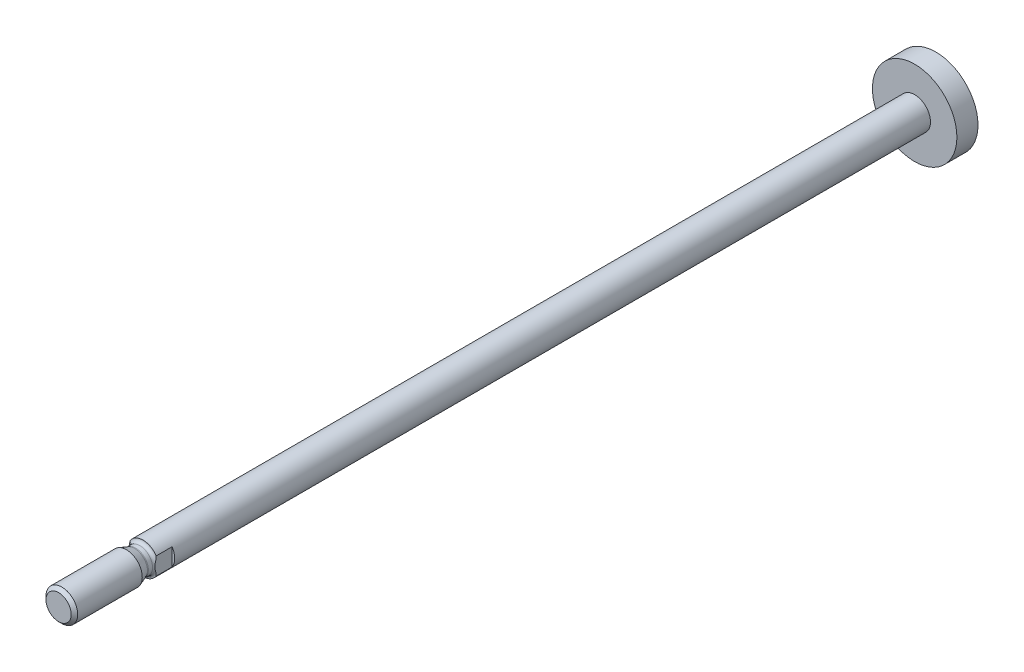
ISO-10303-21;
HEADER;
FILE_DESCRIPTION(('STEP AP214'),'2;1');
FILE_NAME('part.step','',(''),(''),'','','');
FILE_SCHEMA(('AUTOMOTIVE_DESIGN { 1 0 10303 214 1 1 1 1 }'));
ENDSEC;
DATA;
#1=APPLICATION_CONTEXT('core data for automotive mechanical design processes');
#2=APPLICATION_PROTOCOL_DEFINITION('international standard','automotive_design',2000,#1);
#3=PRODUCT_CONTEXT('',#1,'mechanical');
#4=PRODUCT('Part','Part','',(#3));
#5=PRODUCT_RELATED_PRODUCT_CATEGORY('part','',(#4));
#6=PRODUCT_DEFINITION_FORMATION('','',#4);
#7=PRODUCT_DEFINITION_CONTEXT('part definition',#1,'design');
#8=PRODUCT_DEFINITION('design','',#6,#7);
#9=PRODUCT_DEFINITION_SHAPE('','',#8);
#10=(LENGTH_UNIT() NAMED_UNIT(*) SI_UNIT(.MILLI.,.METRE.));
#11=(NAMED_UNIT(*) PLANE_ANGLE_UNIT() SI_UNIT($,.RADIAN.));
#12=(NAMED_UNIT(*) SI_UNIT($,.STERADIAN.) SOLID_ANGLE_UNIT());
#13=UNCERTAINTY_MEASURE_WITH_UNIT(LENGTH_MEASURE(1.E-05),#10,'distance_accuracy_value','');
#14=(GEOMETRIC_REPRESENTATION_CONTEXT(3) GLOBAL_UNCERTAINTY_ASSIGNED_CONTEXT((#13)) GLOBAL_UNIT_ASSIGNED_CONTEXT((#10,
#11,#12)) REPRESENTATION_CONTEXT('',''));
#15=CARTESIAN_POINT('',(0.,0.,0.));
#16=DIRECTION('',(0.,0.,1.));
#17=DIRECTION('',(1.,0.,0.));
#18=AXIS2_PLACEMENT_3D('',#15,#16,#17);
#19=CARTESIAN_POINT('',(0.,0.,-145.2));
#20=DIRECTION('',(0.,0.,1.));
#21=DIRECTION('',(1.,0.,0.));
#22=AXIS2_PLACEMENT_3D('',#19,#20,#21);
#23=CYLINDRICAL_SURFACE('',#22,3.);
#24=CARTESIAN_POINT('',(0.,0.,-141.2));
#25=DIRECTION('',(0.,0.,1.));
#26=DIRECTION('',(1.,0.,0.));
#27=AXIS2_PLACEMENT_3D('',#24,#25,#26);
#28=CIRCLE('',#27,3.);
#29=CARTESIAN_POINT('',(3.,0.,-141.2));
#30=VERTEX_POINT('',#29);
#31=EDGE_CURVE('E123',#30,#30,#28,.T.);
#32=ORIENTED_EDGE('',*,*,#31,.T.);
#33=EDGE_LOOP('',(#32));
#34=FACE_BOUND('',#33,.T.);
#35=DIRECTION('',(0.,0.,1.));
#36=VECTOR('',#35,1.);
#37=CARTESIAN_POINT('',(-2.5,-1.6583123951777,-145.2));
#38=LINE('',#37,#36);
#39=CARTESIAN_POINT('',(-2.5,-1.6583123951777,2.));
#40=VERTEX_POINT('',#39);
#41=CARTESIAN_POINT('',(-2.5,-1.6583123951777,5.));
#42=VERTEX_POINT('',#41);
#43=EDGE_CURVE('E53',#40,#42,#38,.T.);
#44=ORIENTED_EDGE('',*,*,#43,.F.);
#45=CARTESIAN_POINT('',(0.,0.,2.));
#46=DIRECTION('',(0.,0.,1.));
#47=DIRECTION('',(1.,0.,0.));
#48=AXIS2_PLACEMENT_3D('',#45,#46,#47);
#49=CIRCLE('',#48,3.);
#50=CARTESIAN_POINT('',(-2.5,1.6583123951777,2.));
#51=VERTEX_POINT('',#50);
#52=EDGE_CURVE('E11',#51,#40,#49,.T.);
#53=ORIENTED_EDGE('',*,*,#52,.F.);
#54=DIRECTION('',(0.,0.,1.));
#55=VECTOR('',#54,1.);
#56=CARTESIAN_POINT('',(-2.5,1.6583123951777,-145.2));
#57=LINE('',#56,#55);
#58=CARTESIAN_POINT('',(-2.5,1.65831239517778,4.99999999999909));
#59=VERTEX_POINT('',#58);
#60=EDGE_CURVE('E93',#59,#51,#57,.F.);
#61=ORIENTED_EDGE('',*,*,#60,.F.);
#62=CARTESIAN_POINT('',(0.,0.,5.));
#63=DIRECTION('',(0.,0.,1.));
#64=DIRECTION('',(1.,0.,0.));
#65=AXIS2_PLACEMENT_3D('',#62,#63,#64);
#66=CIRCLE('',#65,3.);
#67=CARTESIAN_POINT('',(2.5,1.6583123951777,5.));
#68=VERTEX_POINT('',#67);
#69=EDGE_CURVE('E92',#68,#59,#66,.T.);
#70=ORIENTED_EDGE('',*,*,#69,.F.);
#71=DIRECTION('',(0.,0.,1.));
#72=VECTOR('',#71,1.);
#73=CARTESIAN_POINT('',(2.5,1.6583123951777,-145.2));
#74=LINE('',#73,#72);
#75=CARTESIAN_POINT('',(2.5,1.6583123951777,2.));
#76=VERTEX_POINT('',#75);
#77=EDGE_CURVE('E61',#76,#68,#74,.T.);
#78=ORIENTED_EDGE('',*,*,#77,.F.);
#79=CARTESIAN_POINT('',(2.5,-1.6583123951777,2.));
#80=VERTEX_POINT('',#79);
#81=EDGE_CURVE('E42',#80,#76,#49,.T.);
#82=ORIENTED_EDGE('',*,*,#81,.F.);
#83=DIRECTION('',(0.,0.,1.));
#84=VECTOR('',#83,1.);
#85=CARTESIAN_POINT('',(2.5,-1.6583123951777,-145.2));
#86=LINE('',#85,#84);
#87=CARTESIAN_POINT('',(2.5,-1.65831239517778,4.99999999999909));
#88=VERTEX_POINT('',#87);
#89=EDGE_CURVE('E86',#88,#80,#86,.F.);
#90=ORIENTED_EDGE('',*,*,#89,.F.);
#91=EDGE_CURVE('E126',#42,#88,#66,.T.);
#92=ORIENTED_EDGE('',*,*,#91,.F.);
#93=EDGE_LOOP('',(#44,#53,#61,#70,#78,#82,#90,#92));
#94=FACE_BOUND('',#93,.T.);
#95=ADVANCED_FACE('F39',(#34,#94),#23,.T.);
#96=CARTESIAN_POINT('',(0.,0.,5.6000000000001));
#97=DIRECTION('',(0.,0.,1.));
#98=DIRECTION('',(1.,0.,0.));
#99=AXIS2_PLACEMENT_3D('',#96,#97,#98);
#100=TOROIDAL_SURFACE('',#99,3.0000000000001,0.600000000000099);
#101=CARTESIAN_POINT('',(0.,0.,5.6));
#102=DIRECTION('',(0.,0.,1.));
#103=DIRECTION('',(1.,0.,0.));
#104=AXIS2_PLACEMENT_3D('',#101,#102,#103);
#105=CIRCLE('',#104,2.4);
#106=CARTESIAN_POINT('',(2.4,0.,5.6));
#107=VERTEX_POINT('',#106);
#108=EDGE_CURVE('E114',#107,#107,#105,.T.);
#109=ORIENTED_EDGE('',*,*,#108,.F.);
#110=EDGE_LOOP('',(#109));
#111=FACE_BOUND('',#110,.T.);
#112=CARTESIAN_POINT('',(-2.5,0.,5.26833752096453));
#113=CARTESIAN_POINT('',(-2.5,0.0507234426297441,5.26834839993848));
#114=CARTESIAN_POINT('',(-2.5,0.101441776799662,5.26596843791489));
#115=CARTESIAN_POINT('',(-2.5,0.202536067556288,5.2569952015163));
#116=CARTESIAN_POINT('',(-2.5,0.252911588949165,5.2503973212644));
#117=CARTESIAN_POINT('',(-2.5,0.35392632203634,5.23403658213965));
#118=CARTESIAN_POINT('',(-2.5,0.404557369480025,5.224225913585));
#119=CARTESIAN_POINT('',(-2.5,0.505400398866161,5.20278595137819));
#120=CARTESIAN_POINT('',(-2.5,0.555612509775304,5.1911572409283));
#121=CARTESIAN_POINT('',(-2.5,0.655655613826413,5.16721678219831));
#122=CARTESIAN_POINT('',(-2.5,0.705487327239528,5.15490798008948));
#123=CARTESIAN_POINT('',(-2.5,0.805181864056362,5.13041893752706));
#124=CARTESIAN_POINT('',(-2.5,0.855044688832192,5.11823870324147));
#125=CARTESIAN_POINT('',(-2.5,1.00507376125951,5.08293674920261));
#126=CARTESIAN_POINT('',(-2.5,1.1055660279648,5.06108488117838));
#127=CARTESIAN_POINT('',(-2.5,1.30645493621981,5.02592717471424));
#128=CARTESIAN_POINT('',(-2.5,1.40682678389803,5.01248870030289));
#129=CARTESIAN_POINT('',(-2.5,1.60840199518987,4.99838763017595));
#130=CARTESIAN_POINT('',(-2.5,1.70960094347028,4.99767823287719));
#131=CARTESIAN_POINT('',(-2.5,1.86622781794818,5.01106448653587));
#132=CARTESIAN_POINT('',(-2.5,1.92218137883188,5.01877622049858));
#133=CARTESIAN_POINT('',(-2.5,2.03285053262341,5.0413651074687));
#134=CARTESIAN_POINT('',(-2.5,2.08756307823151,5.05625824117348));
#135=CARTESIAN_POINT('',(-2.5,2.18328084843635,5.09083457513036));
#136=CARTESIAN_POINT('',(-2.5,2.22483950461237,5.10896465354793));
#137=CARTESIAN_POINT('',(-2.5,2.30459524648064,5.1515245306446));
#138=CARTESIAN_POINT('',(-2.5,2.34279989724468,5.17593963670877));
#139=CARTESIAN_POINT('',(-2.5,2.40362753966407,5.22361594487622));
#140=CARTESIAN_POINT('',(-2.5,2.42757076392253,5.24518752529637));
#141=CARTESIAN_POINT('',(-2.5,2.47175757689057,5.29185573262645));
#142=CARTESIAN_POINT('',(-2.5,2.49200531158724,5.31694835263777));
#143=CARTESIAN_POINT('',(-2.5,2.52468492158815,5.36594738678137));
#144=CARTESIAN_POINT('',(-2.5,2.53785643218482,5.38935828111803));
#145=CARTESIAN_POINT('',(-2.5,2.56013164913301,5.43805384411947));
#146=CARTESIAN_POINT('',(-2.5,2.56923737677398,5.46333757440499));
#147=CARTESIAN_POINT('',(-2.5,2.58283057049981,5.51527496834575));
#148=CARTESIAN_POINT('',(-2.5,2.58729356105886,5.54193512227162));
#149=CARTESIAN_POINT('',(-2.5,2.59118020467599,5.59561989324821));
#150=CARTESIAN_POINT('',(-2.5,2.5906054179438,5.62264439487102));
#151=CARTESIAN_POINT('',(-2.5,2.5847447911938,5.67371298536964));
#152=CARTESIAN_POINT('',(-2.5,2.57988467167735,5.69780754958458));
#153=CARTESIAN_POINT('',(-2.5,2.56633022368149,5.74488485425705));
#154=CARTESIAN_POINT('',(-2.5,2.55763543991684,5.76786746233366));
#155=CARTESIAN_POINT('',(-2.5,2.53647695281551,5.81308697753744));
#156=CARTESIAN_POINT('',(-2.5,2.52388217742275,5.83526203314746));
#157=CARTESIAN_POINT('',(-2.5,2.49565831542702,5.87756858678122));
#158=CARTESIAN_POINT('',(-2.5,2.4800283022487,5.897699457906));
#159=CARTESIAN_POINT('',(-2.5,2.4381803160609,5.94494905141413));
#160=CARTESIAN_POINT('',(-2.5,2.41048793322772,5.97076525046522));
#161=CARTESIAN_POINT('',(-2.5,2.35128940318857,6.01762864695372));
#162=CARTESIAN_POINT('',(-2.5,2.31977194494069,6.03866114436212));
#163=CARTESIAN_POINT('',(-2.5,2.23952256294481,6.08463351159361));
#164=CARTESIAN_POINT('',(-2.5,2.18939204577726,6.10711912432076));
#165=CARTESIAN_POINT('',(-2.5,2.086424206848,6.14398267826286));
#166=CARTESIAN_POINT('',(-2.5,2.03358928965091,6.15836768991921));
#167=CARTESIAN_POINT('',(-2.5,1.93599580204544,6.17849484994285));
#168=CARTESIAN_POINT('',(-2.5,1.89144834077192,6.18531116329585));
#169=CARTESIAN_POINT('',(-2.5,1.80189908033616,6.19505697557448));
#170=CARTESIAN_POINT('',(-2.5,1.75689686177072,6.19798247787778));
#171=CARTESIAN_POINT('',(-2.5,1.66646832286127,6.20053377831371));
#172=CARTESIAN_POINT('',(-2.5,1.6210413945456,6.20013412759755));
#173=CARTESIAN_POINT('',(-2.5,1.53034280767568,6.19650595241103));
#174=CARTESIAN_POINT('',(-2.5,1.48507106445849,6.1932793543307));
#175=CARTESIAN_POINT('',(-2.5,1.33918047559004,6.17906735223514));
#176=CARTESIAN_POINT('',(-2.5,1.23902345631669,6.16342028964884));
#177=CARTESIAN_POINT('',(-2.5,1.03994836030368,6.12508984420092));
#178=CARTESIAN_POINT('',(-2.5,0.941034235224376,6.10238806221333));
#179=CARTESIAN_POINT('',(-2.5,0.793509038998567,6.06677672186832));
#180=CARTESIAN_POINT('',(-2.5,0.7446863854637,6.054702575567));
#181=CARTESIAN_POINT('',(-2.5,0.646996290398524,6.030738686552));
#182=CARTESIAN_POINT('',(-2.5,0.598128851070118,6.0188489352388));
#183=CARTESIAN_POINT('',(-2.5,0.500334281886721,5.99617397742217));
#184=CARTESIAN_POINT('',(-2.5,0.451408146263369,5.98538460255591));
#185=CARTESIAN_POINT('',(-2.5,0.353119090508098,5.96594052833405));
#186=CARTESIAN_POINT('',(-2.5,0.303756196305667,5.95728570312374));
#187=CARTESIAN_POINT('',(-2.5,0.204122497966492,5.94328110899502));
#188=CARTESIAN_POINT('',(-2.5,0.153847567097064,5.93795905985694));
#189=CARTESIAN_POINT('',(-2.5,0.0530351286873156,5.93177082830429));
#190=CARTESIAN_POINT('',(-2.5,0.0024977994589948,5.930901937583));
#191=CARTESIAN_POINT('',(-2.5,-0.0985305210715612,5.93381110626722));
#192=CARTESIAN_POINT('',(-2.5,-0.14902123482016,5.93759813511376));
#193=CARTESIAN_POINT('',(-2.5,-0.249573888409545,5.94904126176878));
#194=CARTESIAN_POINT('',(-2.5,-0.299635458091892,5.95670041313862));
#195=CARTESIAN_POINT('',(-2.5,-0.399725252919972,5.97472154484855));
#196=CARTESIAN_POINT('',(-2.5,-0.449748880216866,5.98510788708088));
#197=CARTESIAN_POINT('',(-2.5,-0.549453617514231,6.00732659888942));
#198=CARTESIAN_POINT('',(-2.5,-0.599134785603654,6.01915871651809));
#199=CARTESIAN_POINT('',(-2.5,-0.698392421521691,6.04328051823731));
#200=CARTESIAN_POINT('',(-2.5,-0.747968869022546,6.05557028383309));
#201=CARTESIAN_POINT('',(-2.5,-0.84720464589227,6.07981009984425));
#202=CARTESIAN_POINT('',(-2.5,-0.896863971124109,6.0917601667094));
#203=CARTESIAN_POINT('',(-2.5,-0.975241469303783,6.10978478042876));
#204=CARTESIAN_POINT('',(-2.5,-1.00388150216564,6.11619624816889));
#205=CARTESIAN_POINT('',(-2.5,-1.06125902675178,6.12857195456169));
#206=CARTESIAN_POINT('',(-2.5,-1.08999652018277,6.13453618533974));
#207=CARTESIAN_POINT('',(-2.5,-1.14748265723325,6.1458846074232));
#208=CARTESIAN_POINT('',(-2.5,-1.17623091126653,6.15127075206469));
#209=CARTESIAN_POINT('',(-2.5,-1.23384312688132,6.16137594760793));
#210=CARTESIAN_POINT('',(-2.5,-1.26270708577413,6.16609501391968));
#211=CARTESIAN_POINT('',(-2.5,-1.34949136584038,6.17908804539659));
#212=CARTESIAN_POINT('',(-2.5,-1.40759592627029,6.18619616796949));
#213=CARTESIAN_POINT('',(-2.5,-1.52420669712544,6.19636423685649));
#214=CARTESIAN_POINT('',(-2.5,-1.58271310503325,6.1994220245478));
#215=CARTESIAN_POINT('',(-2.5,-1.70911532678372,6.20051114496721));
#216=CARTESIAN_POINT('',(-2.5,-1.77702602049488,6.19766666103081));
#217=CARTESIAN_POINT('',(-2.5,-1.912149147007,6.18315262249392));
#218=CARTESIAN_POINT('',(-2.5,-1.97936016975703,6.17146782027944));
#219=CARTESIAN_POINT('',(-2.5,-2.09293467910467,6.14162835403314));
#220=CARTESIAN_POINT('',(-2.5,-2.1399801193776,6.12611102431254));
#221=CARTESIAN_POINT('',(-2.5,-2.23116163556241,6.08815370009842));
#222=CARTESIAN_POINT('',(-2.5,-2.27530548479003,6.06573319994486));
#223=CARTESIAN_POINT('',(-2.5,-2.34660579555824,6.0206656653127));
#224=CARTESIAN_POINT('',(-2.5,-2.37498330055351,5.99995880382842));
#225=CARTESIAN_POINT('',(-2.5,-2.42818185419372,5.95435228802646));
#226=CARTESIAN_POINT('',(-2.5,-2.45300628498281,5.92945667074117));
#227=CARTESIAN_POINT('',(-2.5,-2.49337206402375,5.88080957286876));
#228=CARTESIAN_POINT('',(-2.5,-2.50977972671913,5.85778028891266));
#229=CARTESIAN_POINT('',(-2.5,-2.5385948801776,5.80932543735906));
#230=CARTESIAN_POINT('',(-2.5,-2.55100468980703,5.7839012699618));
#231=CARTESIAN_POINT('',(-2.5,-2.57111606880391,5.7310152189761));
#232=CARTESIAN_POINT('',(-2.5,-2.57878240755407,5.70353974708557));
#233=CARTESIAN_POINT('',(-2.5,-2.58865812747843,5.64762323062993));
#234=CARTESIAN_POINT('',(-2.5,-2.59087093912576,5.61918280447873));
#235=CARTESIAN_POINT('',(-2.5,-2.58974032110845,5.56589468768046));
#236=CARTESIAN_POINT('',(-2.5,-2.58704036062141,5.54103102121321));
#237=CARTESIAN_POINT('',(-2.5,-2.57748265423562,5.49212434637714));
#238=CARTESIAN_POINT('',(-2.5,-2.57062518368025,5.46808128377277));
#239=CARTESIAN_POINT('',(-2.5,-2.55318309970271,5.42147694109437));
#240=CARTESIAN_POINT('',(-2.5,-2.54260847384664,5.39891188066154));
#241=CARTESIAN_POINT('',(-2.5,-2.51826231502416,5.35558968714916));
#242=CARTESIAN_POINT('',(-2.5,-2.50448933519591,5.33483337816906));
#243=CARTESIAN_POINT('',(-2.5,-2.46797257111134,5.28708275256527));
#244=CARTESIAN_POINT('',(-2.5,-2.44388663659998,5.26111270404154));
#245=CARTESIAN_POINT('',(-2.5,-2.39183121173732,5.21341702762138));
#246=CARTESIAN_POINT('',(-2.5,-2.36385414462067,5.19169988455002));
#247=CARTESIAN_POINT('',(-2.5,-2.29309604385226,5.14424955817408));
#248=CARTESIAN_POINT('',(-2.5,-2.24896151787955,5.12054273771195));
#249=CARTESIAN_POINT('',(-2.5,-2.15755724893995,5.08032986787273));
#250=CARTESIAN_POINT('',(-2.5,-2.1102815253453,5.0638380357592));
#251=CARTESIAN_POINT('',(-2.5,-1.98539576167196,5.02901994971649));
#252=CARTESIAN_POINT('',(-2.5,-1.90647682078743,5.01544295171964));
#253=CARTESIAN_POINT('',(-2.5,-1.74768813149434,5.00017484346382));
#254=CARTESIAN_POINT('',(-2.5,-1.66781762927049,4.99849388464395));
#255=CARTESIAN_POINT('',(-2.5,-1.45429321635247,5.00579419289827));
#256=CARTESIAN_POINT('',(-2.5,-1.32097329964418,5.02279704607492));
#257=CARTESIAN_POINT('',(-2.5,-1.12273292987174,5.05843900515103));
#258=CARTESIAN_POINT('',(-2.5,-1.05669317759064,5.07208123732001));
#259=CARTESIAN_POINT('',(-2.5,-0.925080173294097,5.10144856377507));
#260=CARTESIAN_POINT('',(-2.5,-0.85950678696237,5.11717303045709));
#261=CARTESIAN_POINT('',(-2.5,-0.728157455724953,5.14928145287764));
#262=CARTESIAN_POINT('',(-2.5,-0.662382356378558,5.16566853749943));
#263=CARTESIAN_POINT('',(-2.5,-0.530451230737349,5.19710748690057));
#264=CARTESIAN_POINT('',(-2.5,-0.46429498692756,5.21215848739435));
#265=CARTESIAN_POINT('',(-2.5,-0.332137198799993,5.23811298682939));
#266=CARTESIAN_POINT('',(-2.5,-0.266147995614798,5.24907485812429));
#267=CARTESIAN_POINT('',(-2.5,-0.13343508853748,5.26417313941374));
#268=CARTESIAN_POINT('',(-2.5,-0.0667131258677896,5.26832321258322));
#269=CARTESIAN_POINT('',(-2.5,0.,5.26833752096453));
#270=B_SPLINE_CURVE_WITH_KNOTS('',3,(#112,#113,#114,#115,#116,#117,#118,#119,#120,#121,#122,
#123,#124,#125,#126,#127,#128,#129,#130,#131,#132,#133,#134,#135,#136,#137,#138,#139,#140,#141,
#142,#143,#144,#145,#146,#147,#148,#149,#150,#151,#152,#153,#154,#155,#156,#157,#158,#159,#160,
#161,#162,#163,#164,#165,#166,#167,#168,#169,#170,#171,#172,#173,#174,#175,#176,#177,#178,#179,
#180,#181,#182,#183,#184,#185,#186,#187,#188,#189,#190,#191,#192,#193,#194,#195,#196,#197,#198,
#199,#200,#201,#202,#203,#204,#205,#206,#207,#208,#209,#210,#211,#212,#213,#214,#215,#216,#217,
#218,#219,#220,#221,#222,#223,#224,#225,#226,#227,#228,#229,#230,#231,#232,#233,#234,#235,#236,
#237,#238,#239,#240,#241,#242,#243,#244,#245,#246,#247,#248,#249,#250,#251,#252,#253,#254,#255,
#256,#257,#258,#259,#260,#261,#262,#263,#264,#265,#266,#267,#268,#269),.UNSPECIFIED.,.T.,.F.,(4,
2,2,2,2,2,2,2,2,2,2,2,2,2,2,2,2,2,2,2,2,2,2,2,2,2,2,2,2,2,2,2,2,2,2,2,2,2,2,2,2,2,2,2,2,2,2,2,2,
2,2,2,2,2,2,2,2,2,2,2,2,2,2,2,2,2,2,2,2,2,2,2,2,2,2,2,2,2,4),(0.,0.152115749462961,
0.304397890479205,0.459057777660119,0.613668153537359,0.76765452052503,0.921648241698668,
1.22999186740174,1.53334327295527,1.83557910296654,2.00468122496769,2.17416139710525,
2.30975526259906,2.44503498191611,2.54138706790922,2.63763038250484,2.71788414225495,
2.79809795959123,2.87873253660465,2.95934214181033,3.03274594433316,3.10615846435156,
3.18237030946167,3.25860545664829,3.37154774885102,3.48483255287211,3.64874326809032,
3.81251069461259,3.94751849926572,4.08266487644991,4.21884653384819,4.35493546397263,
4.65852821936571,4.96291950372185,5.11380283698696,5.2646791123006,5.41496078164642,
5.56523358814694,5.71674021710462,5.86815469233289,6.01986131905259,6.17168776888823,
6.3249195654772,6.47812469716163,6.63135724578266,6.7845823615018,6.87262624262423,
6.9606716735928,7.04840955727845,7.13614541382411,7.31164210225534,7.487232283928,
7.69072100095721,7.89456149389004,8.04275027379228,8.1905243529531,8.29556794817655,
8.40051087855684,8.48500651711341,8.56945305722983,8.65451949621374,8.73953241154295,
8.81419843639983,8.88885951681877,8.96332150589878,9.03781724571823,9.14348655987521,
9.24936459025057,9.39882327642183,9.54857516145059,9.78744806917548,10.0265247936209,
10.4280628477144,10.630387719692,10.8326517473681,11.0360188284461,11.239516519211,
11.439986712254,11.6400543065313),.UNSPECIFIED.);
#271=EDGE_CURVE('E84',#42,#59,#270,.T.);
#272=ORIENTED_EDGE('',*,*,#271,.F.);
#273=ORIENTED_EDGE('',*,*,#91,.T.);
#274=CARTESIAN_POINT('',(2.5,0.,5.26833752096453));
#275=CARTESIAN_POINT('',(2.5,-0.0507234426297441,5.26834839993848));
#276=CARTESIAN_POINT('',(2.5,-0.101441776799662,5.26596843791489));
#277=CARTESIAN_POINT('',(2.5,-0.202536067556288,5.2569952015163));
#278=CARTESIAN_POINT('',(2.5,-0.252911588949165,5.2503973212644));
#279=CARTESIAN_POINT('',(2.5,-0.35392632203634,5.23403658213965));
#280=CARTESIAN_POINT('',(2.5,-0.404557369480025,5.224225913585));
#281=CARTESIAN_POINT('',(2.5,-0.505400398866161,5.20278595137819));
#282=CARTESIAN_POINT('',(2.5,-0.555612509775304,5.1911572409283));
#283=CARTESIAN_POINT('',(2.5,-0.655655613826413,5.16721678219831));
#284=CARTESIAN_POINT('',(2.5,-0.705487327239528,5.15490798008948));
#285=CARTESIAN_POINT('',(2.5,-0.805181864056362,5.13041893752706));
#286=CARTESIAN_POINT('',(2.5,-0.855044688832192,5.11823870324147));
#287=CARTESIAN_POINT('',(2.5,-1.00507376125951,5.08293674920261));
#288=CARTESIAN_POINT('',(2.5,-1.1055660279648,5.06108488117838));
#289=CARTESIAN_POINT('',(2.5,-1.30645493621981,5.02592717471424));
#290=CARTESIAN_POINT('',(2.5,-1.40682678389803,5.01248870030289));
#291=CARTESIAN_POINT('',(2.5,-1.60840199518987,4.99838763017595));
#292=CARTESIAN_POINT('',(2.5,-1.70960094347028,4.99767823287719));
#293=CARTESIAN_POINT('',(2.5,-1.86622781794818,5.01106448653587));
#294=CARTESIAN_POINT('',(2.5,-1.92218137883188,5.01877622049858));
#295=CARTESIAN_POINT('',(2.5,-2.03285053262341,5.0413651074687));
#296=CARTESIAN_POINT('',(2.5,-2.08756307823151,5.05625824117348));
#297=CARTESIAN_POINT('',(2.5,-2.18328084843635,5.09083457513036));
#298=CARTESIAN_POINT('',(2.5,-2.22483950461237,5.10896465354793));
#299=CARTESIAN_POINT('',(2.5,-2.30459524648064,5.1515245306446));
#300=CARTESIAN_POINT('',(2.5,-2.34279989724468,5.17593963670877));
#301=CARTESIAN_POINT('',(2.5,-2.40362753966407,5.22361594487622));
#302=CARTESIAN_POINT('',(2.5,-2.42757076392253,5.24518752529637));
#303=CARTESIAN_POINT('',(2.5,-2.47175757689057,5.29185573262645));
#304=CARTESIAN_POINT('',(2.5,-2.49200531158724,5.31694835263777));
#305=CARTESIAN_POINT('',(2.5,-2.52468492158815,5.36594738678137));
#306=CARTESIAN_POINT('',(2.5,-2.53785643218482,5.38935828111803));
#307=CARTESIAN_POINT('',(2.5,-2.56013164913301,5.43805384411947));
#308=CARTESIAN_POINT('',(2.5,-2.56923737677398,5.46333757440499));
#309=CARTESIAN_POINT('',(2.5,-2.58283057049981,5.51527496834575));
#310=CARTESIAN_POINT('',(2.5,-2.58729356105886,5.54193512227162));
#311=CARTESIAN_POINT('',(2.5,-2.59118020467599,5.59561989324821));
#312=CARTESIAN_POINT('',(2.5,-2.5906054179438,5.62264439487102));
#313=CARTESIAN_POINT('',(2.5,-2.5847447911938,5.67371298536964));
#314=CARTESIAN_POINT('',(2.5,-2.57988467167735,5.69780754958458));
#315=CARTESIAN_POINT('',(2.5,-2.56633022368149,5.74488485425705));
#316=CARTESIAN_POINT('',(2.5,-2.55763543991684,5.76786746233366));
#317=CARTESIAN_POINT('',(2.5,-2.53647695281551,5.81308697753744));
#318=CARTESIAN_POINT('',(2.5,-2.52388217742275,5.83526203314746));
#319=CARTESIAN_POINT('',(2.5,-2.49565831542702,5.87756858678122));
#320=CARTESIAN_POINT('',(2.5,-2.4800283022487,5.897699457906));
#321=CARTESIAN_POINT('',(2.5,-2.4381803160609,5.94494905141413));
#322=CARTESIAN_POINT('',(2.5,-2.41048793322772,5.97076525046522));
#323=CARTESIAN_POINT('',(2.5,-2.35128940318857,6.01762864695372));
#324=CARTESIAN_POINT('',(2.5,-2.31977194494069,6.03866114436212));
#325=CARTESIAN_POINT('',(2.5,-2.23952256294481,6.08463351159361));
#326=CARTESIAN_POINT('',(2.5,-2.18939204577726,6.10711912432076));
#327=CARTESIAN_POINT('',(2.5,-2.086424206848,6.14398267826286));
#328=CARTESIAN_POINT('',(2.5,-2.03358928965091,6.15836768991921));
#329=CARTESIAN_POINT('',(2.5,-1.93599580204544,6.17849484994285));
#330=CARTESIAN_POINT('',(2.5,-1.89144834077192,6.18531116329585));
#331=CARTESIAN_POINT('',(2.5,-1.80189908033616,6.19505697557448));
#332=CARTESIAN_POINT('',(2.5,-1.75689686177072,6.19798247787778));
#333=CARTESIAN_POINT('',(2.5,-1.66646832286127,6.20053377831371));
#334=CARTESIAN_POINT('',(2.5,-1.6210413945456,6.20013412759755));
#335=CARTESIAN_POINT('',(2.5,-1.53034280767568,6.19650595241103));
#336=CARTESIAN_POINT('',(2.5,-1.48507106445849,6.1932793543307));
#337=CARTESIAN_POINT('',(2.5,-1.33918047559004,6.17906735223514));
#338=CARTESIAN_POINT('',(2.5,-1.23902345631669,6.16342028964884));
#339=CARTESIAN_POINT('',(2.5,-1.03994836030368,6.12508984420092));
#340=CARTESIAN_POINT('',(2.5,-0.941034235224376,6.10238806221333));
#341=CARTESIAN_POINT('',(2.5,-0.793509038998567,6.06677672186832));
#342=CARTESIAN_POINT('',(2.5,-0.7446863854637,6.054702575567));
#343=CARTESIAN_POINT('',(2.5,-0.646996290398524,6.030738686552));
#344=CARTESIAN_POINT('',(2.5,-0.598128851070118,6.0188489352388));
#345=CARTESIAN_POINT('',(2.5,-0.500334281886721,5.99617397742217));
#346=CARTESIAN_POINT('',(2.5,-0.451408146263369,5.98538460255591));
#347=CARTESIAN_POINT('',(2.5,-0.353119090508098,5.96594052833405));
#348=CARTESIAN_POINT('',(2.5,-0.303756196305667,5.95728570312374));
#349=CARTESIAN_POINT('',(2.5,-0.204122497966492,5.94328110899502));
#350=CARTESIAN_POINT('',(2.5,-0.153847567097064,5.93795905985694));
#351=CARTESIAN_POINT('',(2.5,-0.0530351286873156,5.93177082830429));
#352=CARTESIAN_POINT('',(2.5,-0.0024977994589948,5.930901937583));
#353=CARTESIAN_POINT('',(2.5,0.0985305210715612,5.93381110626722));
#354=CARTESIAN_POINT('',(2.5,0.14902123482016,5.93759813511376));
#355=CARTESIAN_POINT('',(2.5,0.249573888409545,5.94904126176878));
#356=CARTESIAN_POINT('',(2.5,0.299635458091892,5.95670041313862));
#357=CARTESIAN_POINT('',(2.5,0.399725252919972,5.97472154484855));
#358=CARTESIAN_POINT('',(2.5,0.449748880216866,5.98510788708088));
#359=CARTESIAN_POINT('',(2.5,0.549453617514231,6.00732659888942));
#360=CARTESIAN_POINT('',(2.5,0.599134785603654,6.01915871651809));
#361=CARTESIAN_POINT('',(2.5,0.698392421521691,6.04328051823731));
#362=CARTESIAN_POINT('',(2.5,0.747968869022546,6.05557028383309));
#363=CARTESIAN_POINT('',(2.5,0.84720464589227,6.07981009984425));
#364=CARTESIAN_POINT('',(2.5,0.896863971124109,6.0917601667094));
#365=CARTESIAN_POINT('',(2.5,0.975241469303783,6.10978478042876));
#366=CARTESIAN_POINT('',(2.5,1.00388150216564,6.11619624816889));
#367=CARTESIAN_POINT('',(2.5,1.06125902675178,6.12857195456169));
#368=CARTESIAN_POINT('',(2.5,1.08999652018277,6.13453618533974));
#369=CARTESIAN_POINT('',(2.5,1.14748265723325,6.1458846074232));
#370=CARTESIAN_POINT('',(2.5,1.17623091126653,6.15127075206469));
#371=CARTESIAN_POINT('',(2.5,1.23384312688132,6.16137594760793));
#372=CARTESIAN_POINT('',(2.5,1.26270708577413,6.16609501391968));
#373=CARTESIAN_POINT('',(2.5,1.34949136584038,6.17908804539659));
#374=CARTESIAN_POINT('',(2.5,1.40759592627029,6.18619616796949));
#375=CARTESIAN_POINT('',(2.5,1.52420669712544,6.19636423685649));
#376=CARTESIAN_POINT('',(2.5,1.58271310503325,6.1994220245478));
#377=CARTESIAN_POINT('',(2.5,1.70911532678372,6.20051114496721));
#378=CARTESIAN_POINT('',(2.5,1.77702602049488,6.19766666103081));
#379=CARTESIAN_POINT('',(2.5,1.912149147007,6.18315262249392));
#380=CARTESIAN_POINT('',(2.5,1.97936016975703,6.17146782027944));
#381=CARTESIAN_POINT('',(2.5,2.09293467910467,6.14162835403314));
#382=CARTESIAN_POINT('',(2.5,2.1399801193776,6.12611102431254));
#383=CARTESIAN_POINT('',(2.5,2.23116163556241,6.08815370009842));
#384=CARTESIAN_POINT('',(2.5,2.27530548479003,6.06573319994486));
#385=CARTESIAN_POINT('',(2.5,2.34660579555824,6.0206656653127));
#386=CARTESIAN_POINT('',(2.5,2.37498330055351,5.99995880382842));
#387=CARTESIAN_POINT('',(2.5,2.42818185419372,5.95435228802646));
#388=CARTESIAN_POINT('',(2.5,2.45300628498281,5.92945667074117));
#389=CARTESIAN_POINT('',(2.5,2.49337206402375,5.88080957286876));
#390=CARTESIAN_POINT('',(2.5,2.50977972671913,5.85778028891266));
#391=CARTESIAN_POINT('',(2.5,2.5385948801776,5.80932543735906));
#392=CARTESIAN_POINT('',(2.5,2.55100468980703,5.7839012699618));
#393=CARTESIAN_POINT('',(2.5,2.57111606880391,5.7310152189761));
#394=CARTESIAN_POINT('',(2.5,2.57878240755407,5.70353974708557));
#395=CARTESIAN_POINT('',(2.5,2.58865812747843,5.64762323062993));
#396=CARTESIAN_POINT('',(2.5,2.59087093912576,5.61918280447873));
#397=CARTESIAN_POINT('',(2.5,2.58974032110845,5.56589468768046));
#398=CARTESIAN_POINT('',(2.5,2.58704036062141,5.54103102121321));
#399=CARTESIAN_POINT('',(2.5,2.57748265423562,5.49212434637714));
#400=CARTESIAN_POINT('',(2.5,2.57062518368025,5.46808128377277));
#401=CARTESIAN_POINT('',(2.5,2.55318309970271,5.42147694109437));
#402=CARTESIAN_POINT('',(2.5,2.54260847384664,5.39891188066154));
#403=CARTESIAN_POINT('',(2.5,2.51826231502416,5.35558968714916));
#404=CARTESIAN_POINT('',(2.5,2.50448933519591,5.33483337816906));
#405=CARTESIAN_POINT('',(2.5,2.46797257111134,5.28708275256527));
#406=CARTESIAN_POINT('',(2.5,2.44388663659998,5.26111270404154));
#407=CARTESIAN_POINT('',(2.5,2.39183121173732,5.21341702762138));
#408=CARTESIAN_POINT('',(2.5,2.36385414462067,5.19169988455002));
#409=CARTESIAN_POINT('',(2.5,2.29309604385226,5.14424955817408));
#410=CARTESIAN_POINT('',(2.5,2.24896151787955,5.12054273771195));
#411=CARTESIAN_POINT('',(2.5,2.15755724893995,5.08032986787273));
#412=CARTESIAN_POINT('',(2.5,2.1102815253453,5.0638380357592));
#413=CARTESIAN_POINT('',(2.5,1.98539576167196,5.02901994971649));
#414=CARTESIAN_POINT('',(2.5,1.90647682078743,5.01544295171964));
#415=CARTESIAN_POINT('',(2.5,1.74768813149434,5.00017484346382));
#416=CARTESIAN_POINT('',(2.5,1.66781762927049,4.99849388464395));
#417=CARTESIAN_POINT('',(2.5,1.45429321635247,5.00579419289827));
#418=CARTESIAN_POINT('',(2.5,1.32097329964418,5.02279704607492));
#419=CARTESIAN_POINT('',(2.5,1.12273292987174,5.05843900515103));
#420=CARTESIAN_POINT('',(2.5,1.05669317759064,5.07208123732001));
#421=CARTESIAN_POINT('',(2.5,0.925080173294097,5.10144856377507));
#422=CARTESIAN_POINT('',(2.5,0.85950678696237,5.11717303045709));
#423=CARTESIAN_POINT('',(2.5,0.728157455724953,5.14928145287764));
#424=CARTESIAN_POINT('',(2.5,0.662382356378558,5.16566853749943));
#425=CARTESIAN_POINT('',(2.5,0.530451230737349,5.19710748690057));
#426=CARTESIAN_POINT('',(2.5,0.46429498692756,5.21215848739435));
#427=CARTESIAN_POINT('',(2.5,0.332137198799993,5.23811298682939));
#428=CARTESIAN_POINT('',(2.5,0.266147995614798,5.24907485812429));
#429=CARTESIAN_POINT('',(2.5,0.13343508853748,5.26417313941374));
#430=CARTESIAN_POINT('',(2.5,0.0667131258677896,5.26832321258322));
#431=CARTESIAN_POINT('',(2.5,0.,5.26833752096453));
#432=B_SPLINE_CURVE_WITH_KNOTS('',3,(#274,#275,#276,#277,#278,#279,#280,#281,#282,#283,#284,
#285,#286,#287,#288,#289,#290,#291,#292,#293,#294,#295,#296,#297,#298,#299,#300,#301,#302,#303,
#304,#305,#306,#307,#308,#309,#310,#311,#312,#313,#314,#315,#316,#317,#318,#319,#320,#321,#322,
#323,#324,#325,#326,#327,#328,#329,#330,#331,#332,#333,#334,#335,#336,#337,#338,#339,#340,#341,
#342,#343,#344,#345,#346,#347,#348,#349,#350,#351,#352,#353,#354,#355,#356,#357,#358,#359,#360,
#361,#362,#363,#364,#365,#366,#367,#368,#369,#370,#371,#372,#373,#374,#375,#376,#377,#378,#379,
#380,#381,#382,#383,#384,#385,#386,#387,#388,#389,#390,#391,#392,#393,#394,#395,#396,#397,#398,
#399,#400,#401,#402,#403,#404,#405,#406,#407,#408,#409,#410,#411,#412,#413,#414,#415,#416,#417,
#418,#419,#420,#421,#422,#423,#424,#425,#426,#427,#428,#429,#430,#431),.UNSPECIFIED.,.T.,.F.,(4,
2,2,2,2,2,2,2,2,2,2,2,2,2,2,2,2,2,2,2,2,2,2,2,2,2,2,2,2,2,2,2,2,2,2,2,2,2,2,2,2,2,2,2,2,2,2,2,2,
2,2,2,2,2,2,2,2,2,2,2,2,2,2,2,2,2,2,2,2,2,2,2,2,2,2,2,2,2,4),(0.,0.152115749462961,
0.304397890479205,0.459057777660119,0.613668153537359,0.76765452052503,0.921648241698668,
1.22999186740174,1.53334327295527,1.83557910296654,2.00468122496769,2.17416139710525,
2.30975526259906,2.44503498191611,2.54138706790922,2.63763038250484,2.71788414225495,
2.79809795959123,2.87873253660465,2.95934214181033,3.03274594433316,3.10615846435156,
3.18237030946167,3.25860545664829,3.37154774885102,3.48483255287211,3.64874326809032,
3.81251069461259,3.94751849926572,4.08266487644991,4.21884653384819,4.35493546397263,
4.65852821936571,4.96291950372185,5.11380283698696,5.2646791123006,5.41496078164642,
5.56523358814694,5.71674021710462,5.86815469233289,6.01986131905259,6.17168776888823,
6.3249195654772,6.47812469716163,6.63135724578266,6.7845823615018,6.87262624262423,
6.9606716735928,7.04840955727845,7.13614541382411,7.31164210225534,7.487232283928,
7.69072100095721,7.89456149389004,8.04275027379228,8.1905243529531,8.29556794817655,
8.40051087855684,8.48500651711341,8.56945305722983,8.65451949621374,8.73953241154295,
8.81419843639983,8.88885951681877,8.96332150589878,9.03781724571823,9.14348655987521,
9.24936459025057,9.39882327642183,9.54857516145059,9.78744806917548,10.0265247936209,
10.4280628477144,10.630387719692,10.8326517473681,11.0360188284461,11.239516519211,
11.439986712254,11.6400543065313),.UNSPECIFIED.);
#433=EDGE_CURVE('E128',#68,#88,#432,.T.);
#434=ORIENTED_EDGE('',*,*,#433,.F.);
#435=ORIENTED_EDGE('',*,*,#69,.T.);
#436=EDGE_LOOP('',(#272,#273,#434,#435));
#437=FACE_BOUND('',#436,.T.);
#438=ADVANCED_FACE('F138',(#111,#437),#100,.F.);
#439=CARTESIAN_POINT('',(0.,3.,-141.2));
#440=DIRECTION('',(0.,0.,-1.));
#441=DIRECTION('',(-1.,0.,0.));
#442=AXIS2_PLACEMENT_3D('',#439,#440,#441);
#443=PLANE('',#442);
#444=ORIENTED_EDGE('',*,*,#31,.F.);
#445=EDGE_LOOP('',(#444));
#446=FACE_BOUND('',#445,.T.);
#447=CARTESIAN_POINT('',(0.,0.,-141.2));
#448=DIRECTION('',(0.,0.,1.));
#449=DIRECTION('',(1.,0.,0.));
#450=AXIS2_PLACEMENT_3D('',#447,#448,#449);
#451=CIRCLE('',#450,8.);
#452=CARTESIAN_POINT('',(8.,0.,-141.2));
#453=VERTEX_POINT('',#452);
#454=EDGE_CURVE('E120',#453,#453,#451,.T.);
#455=ORIENTED_EDGE('',*,*,#454,.T.);
#456=EDGE_LOOP('',(#455));
#457=FACE_BOUND('',#456,.T.);
#458=ADVANCED_FACE('F185',(#446,#457),#443,.F.);
#459=CARTESIAN_POINT('',(0.,0.,-145.2));
#460=DIRECTION('',(0.,0.,1.));
#461=DIRECTION('',(1.,0.,0.));
#462=AXIS2_PLACEMENT_3D('',#459,#460,#461);
#463=CYLINDRICAL_SURFACE('',#462,8.);
#464=ORIENTED_EDGE('',*,*,#454,.F.);
#465=EDGE_LOOP('',(#464));
#466=FACE_BOUND('',#465,.T.);
#467=CARTESIAN_POINT('',(0.,0.,-145.2));
#468=DIRECTION('',(0.,0.,1.));
#469=DIRECTION('',(1.,0.,0.));
#470=AXIS2_PLACEMENT_3D('',#467,#468,#469);
#471=CIRCLE('',#470,8.);
#472=CARTESIAN_POINT('',(8.,0.,-145.2));
#473=VERTEX_POINT('',#472);
#474=EDGE_CURVE('E117',#473,#473,#471,.T.);
#475=ORIENTED_EDGE('',*,*,#474,.T.);
#476=EDGE_LOOP('',(#475));
#477=FACE_BOUND('',#476,.T.);
#478=ADVANCED_FACE('F176',(#466,#477),#463,.T.);
#479=CARTESIAN_POINT('',(0.,8.,-145.2));
#480=DIRECTION('',(0.,0.,1.));
#481=DIRECTION('',(1.,0.,0.));
#482=AXIS2_PLACEMENT_3D('',#479,#480,#481);
#483=PLANE('',#482);
#484=ORIENTED_EDGE('',*,*,#474,.F.);
#485=EDGE_LOOP('',(#484));
#486=FACE_BOUND('',#485,.T.);
#487=ADVANCED_FACE('F171',(#486),#483,.F.);
#488=CARTESIAN_POINT('',(0.,0.,4.));
#489=DIRECTION('',(0.,0.,1.));
#490=DIRECTION('',(1.,0.,0.));
#491=AXIS2_PLACEMENT_3D('',#488,#489,#490);
#492=CYLINDRICAL_SURFACE('',#491,2.4);
#493=CARTESIAN_POINT('',(0.,0.,6.3942038115749));
#494=DIRECTION('',(0.,0.,1.));
#495=DIRECTION('',(1.,0.,0.));
#496=AXIS2_PLACEMENT_3D('',#493,#494,#495);
#497=CIRCLE('',#496,2.4);
#498=CARTESIAN_POINT('',(2.4,0.,6.3942038115749));
#499=VERTEX_POINT('',#498);
#500=EDGE_CURVE('E111',#499,#499,#497,.T.);
#501=ORIENTED_EDGE('',*,*,#500,.F.);
#502=EDGE_LOOP('',(#501));
#503=FACE_BOUND('',#502,.T.);
#504=ORIENTED_EDGE('',*,*,#108,.T.);
#505=EDGE_LOOP('',(#504));
#506=FACE_BOUND('',#505,.T.);
#507=ADVANCED_FACE('F168',(#503,#506),#492,.T.);
#508=CARTESIAN_POINT('',(0.,0.,6.39420381157482));
#509=DIRECTION('',(0.,0.,1.));
#510=DIRECTION('',(1.,0.,0.));
#511=AXIS2_PLACEMENT_3D('',#508,#509,#510);
#512=TOROIDAL_SURFACE('',#511,2.99999999999972,0.599999999999719);
#513=CARTESIAN_POINT('',(0.,0.,6.5994158975703));
#514=DIRECTION('',(0.,0.,1.));
#515=DIRECTION('',(1.,0.,0.));
#516=AXIS2_PLACEMENT_3D('',#513,#514,#515);
#517=CIRCLE('',#516,2.4361844275285);
#518=CARTESIAN_POINT('',(2.4361844275285,0.,6.5994158975703));
#519=VERTEX_POINT('',#518);
#520=EDGE_CURVE('E108',#519,#519,#517,.T.);
#521=ORIENTED_EDGE('',*,*,#520,.F.);
#522=EDGE_LOOP('',(#521));
#523=FACE_BOUND('',#522,.T.);
#524=ORIENTED_EDGE('',*,*,#500,.T.);
#525=EDGE_LOOP('',(#524));
#526=FACE_BOUND('',#525,.T.);
#527=ADVANCED_FACE('F165',(#523,#526),#512,.F.);
#528=CARTESIAN_POINT('',(0.,0.,6.5994158975703));
#529=DIRECTION('',(0.,0.,1.));
#530=DIRECTION('',(1.,0.,0.));
#531=AXIS2_PLACEMENT_3D('',#528,#529,#530);
#532=CONICAL_SURFACE('',#531,2.4361844275285,0.34906585039883);
#533=CARTESIAN_POINT('',(0.,0.,8.1484864516728));
#534=DIRECTION('',(0.,0.,1.));
#535=DIRECTION('',(1.,0.,0.));
#536=AXIS2_PLACEMENT_3D('',#533,#534,#535);
#537=CIRCLE('',#536,3.);
#538=CARTESIAN_POINT('',(3.,0.,8.1484864516728));
#539=VERTEX_POINT('',#538);
#540=EDGE_CURVE('E105',#539,#539,#537,.T.);
#541=ORIENTED_EDGE('',*,*,#540,.F.);
#542=EDGE_LOOP('',(#541));
#543=FACE_BOUND('',#542,.T.);
#544=ORIENTED_EDGE('',*,*,#520,.T.);
#545=EDGE_LOOP('',(#544));
#546=FACE_BOUND('',#545,.T.);
#547=ADVANCED_FACE('F161',(#543,#546),#532,.T.);
#548=CARTESIAN_POINT('',(0.,0.,4.));
#549=DIRECTION('',(0.,0.,1.));
#550=DIRECTION('',(1.,0.,0.));
#551=AXIS2_PLACEMENT_3D('',#548,#549,#550);
#552=CYLINDRICAL_SURFACE('',#551,3.);
#553=CARTESIAN_POINT('',(0.,0.,20.3865));
#554=DIRECTION('',(0.,0.,1.));
#555=DIRECTION('',(1.,0.,0.));
#556=AXIS2_PLACEMENT_3D('',#553,#554,#555);
#557=CIRCLE('',#556,3.);
#558=CARTESIAN_POINT('',(3.,0.,20.3865));
#559=VERTEX_POINT('',#558);
#560=EDGE_CURVE('E102',#559,#559,#557,.T.);
#561=ORIENTED_EDGE('',*,*,#560,.F.);
#562=EDGE_LOOP('',(#561));
#563=FACE_BOUND('',#562,.T.);
#564=ORIENTED_EDGE('',*,*,#540,.T.);
#565=EDGE_LOOP('',(#564));
#566=FACE_BOUND('',#565,.T.);
#567=ADVANCED_FACE('F157',(#563,#566),#552,.T.);
#568=CARTESIAN_POINT('',(0.,0.,20.3865));
#569=DIRECTION('',(0.,0.,-1.));
#570=DIRECTION('',(-1.,0.,0.));
#571=AXIS2_PLACEMENT_3D('',#568,#569,#570);
#572=CONICAL_SURFACE('',#571,3.,0.785398163397449);
#573=CARTESIAN_POINT('',(0.,0.,21.));
#574=DIRECTION('',(0.,0.,1.));
#575=DIRECTION('',(1.,0.,0.));
#576=AXIS2_PLACEMENT_3D('',#573,#574,#575);
#577=CIRCLE('',#576,2.3865);
#578=CARTESIAN_POINT('',(2.3865,0.,21.));
#579=VERTEX_POINT('',#578);
#580=EDGE_CURVE('E99',#579,#579,#577,.T.);
#581=ORIENTED_EDGE('',*,*,#580,.F.);
#582=EDGE_LOOP('',(#581));
#583=FACE_BOUND('',#582,.T.);
#584=ORIENTED_EDGE('',*,*,#560,.T.);
#585=EDGE_LOOP('',(#584));
#586=FACE_BOUND('',#585,.T.);
#587=ADVANCED_FACE('F153',(#583,#586),#572,.T.);
#588=CARTESIAN_POINT('',(0.,0.,21.));
#589=DIRECTION('',(0.,0.,-1.));
#590=DIRECTION('',(-1.,0.,0.));
#591=AXIS2_PLACEMENT_3D('',#588,#589,#590);
#592=PLANE('',#591);
#593=ORIENTED_EDGE('',*,*,#580,.T.);
#594=EDGE_LOOP('',(#593));
#595=FACE_BOUND('',#594,.T.);
#596=ADVANCED_FACE('F145',(#595),#592,.F.);
#597=CARTESIAN_POINT('',(2.5,5.,6.));
#598=DIRECTION('',(1.,0.,0.));
#599=DIRECTION('',(0.,0.,-1.));
#600=AXIS2_PLACEMENT_3D('',#597,#598,#599);
#601=PLANE('',#600);
#602=ORIENTED_EDGE('',*,*,#77,.T.);
#603=ORIENTED_EDGE('',*,*,#433,.T.);
#604=ORIENTED_EDGE('',*,*,#89,.T.);
#605=DIRECTION('',(0.,-1.,0.));
#606=VECTOR('',#605,1.);
#607=CARTESIAN_POINT('',(2.5,5.,2.));
#608=LINE('',#607,#606);
#609=EDGE_CURVE('E81',#76,#80,#608,.T.);
#610=ORIENTED_EDGE('',*,*,#609,.F.);
#611=EDGE_LOOP('',(#602,#603,#604,#610));
#612=FACE_BOUND('',#611,.T.);
#613=ADVANCED_FACE('F85',(#612),#601,.T.);
#614=CARTESIAN_POINT('',(0.,0.,2.));
#615=DIRECTION('',(0.,0.,1.));
#616=DIRECTION('',(1.,0.,0.));
#617=AXIS2_PLACEMENT_3D('',#614,#615,#616);
#618=PLANE('',#617);
#619=ORIENTED_EDGE('',*,*,#81,.T.);
#620=ORIENTED_EDGE('',*,*,#609,.T.);
#621=EDGE_LOOP('',(#619,#620));
#622=FACE_BOUND('',#621,.T.);
#623=ADVANCED_FACE('F80',(#622),#618,.T.);
#624=ORIENTED_EDGE('',*,*,#52,.T.);
#625=DIRECTION('',(0.,1.,0.));
#626=VECTOR('',#625,1.);
#627=CARTESIAN_POINT('',(-2.5,-5.,2.));
#628=LINE('',#627,#626);
#629=EDGE_CURVE('E87',#40,#51,#628,.T.);
#630=ORIENTED_EDGE('',*,*,#629,.T.);
#631=EDGE_LOOP('',(#624,#630));
#632=FACE_BOUND('',#631,.T.);
#633=ADVANCED_FACE('F146',(#632),#618,.T.);
#634=CARTESIAN_POINT('',(-2.5,-5.,6.));
#635=DIRECTION('',(-1.,0.,0.));
#636=DIRECTION('',(0.,0.,1.));
#637=AXIS2_PLACEMENT_3D('',#634,#635,#636);
#638=PLANE('',#637);
#639=ORIENTED_EDGE('',*,*,#43,.T.);
#640=ORIENTED_EDGE('',*,*,#271,.T.);
#641=ORIENTED_EDGE('',*,*,#60,.T.);
#642=ORIENTED_EDGE('',*,*,#629,.F.);
#643=EDGE_LOOP('',(#639,#640,#641,#642));
#644=FACE_BOUND('',#643,.T.);
#645=ADVANCED_FACE('F147',(#644),#638,.T.);
#646=CLOSED_SHELL('',(#95,#438,#458,#478,#487,#507,#527,#547,#567,#587,#596,#613,#623,#633,#645));
#647=MANIFOLD_SOLID_BREP('B2',#646);
#648=ADVANCED_BREP_SHAPE_REPRESENTATION('',(#18,#647),#14);
#649=SHAPE_DEFINITION_REPRESENTATION(#9,#648);
ENDSEC;
END-ISO-10303-21;
